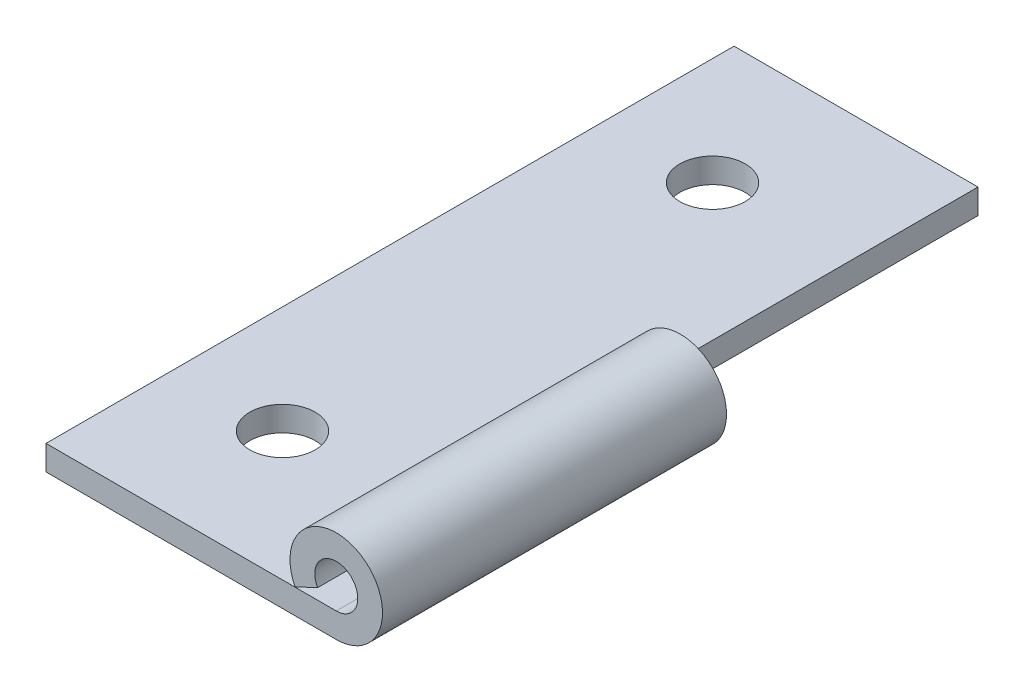
ISO-10303-21;
HEADER;
FILE_DESCRIPTION(('STEP AP214'),'2;1');
FILE_NAME('part.step','',(''),(''),'','','');
FILE_SCHEMA(('AUTOMOTIVE_DESIGN { 1 0 10303 214 1 1 1 1 }'));
ENDSEC;
DATA;
#1=APPLICATION_CONTEXT('core data for automotive mechanical design processes');
#2=APPLICATION_PROTOCOL_DEFINITION('international standard','automotive_design',2000,#1);
#3=PRODUCT_CONTEXT('',#1,'mechanical');
#4=PRODUCT('Part','Part','',(#3));
#5=PRODUCT_RELATED_PRODUCT_CATEGORY('part','',(#4));
#6=PRODUCT_DEFINITION_FORMATION('','',#4);
#7=PRODUCT_DEFINITION_CONTEXT('part definition',#1,'design');
#8=PRODUCT_DEFINITION('design','',#6,#7);
#9=PRODUCT_DEFINITION_SHAPE('','',#8);
#10=(LENGTH_UNIT() NAMED_UNIT(*) SI_UNIT(.MILLI.,.METRE.));
#11=(NAMED_UNIT(*) PLANE_ANGLE_UNIT() SI_UNIT($,.RADIAN.));
#12=(NAMED_UNIT(*) SI_UNIT($,.STERADIAN.) SOLID_ANGLE_UNIT());
#13=UNCERTAINTY_MEASURE_WITH_UNIT(LENGTH_MEASURE(1.E-05),#10,'distance_accuracy_value','');
#14=(GEOMETRIC_REPRESENTATION_CONTEXT(3) GLOBAL_UNCERTAINTY_ASSIGNED_CONTEXT((#13)) GLOBAL_UNIT_ASSIGNED_CONTEXT((#10,
#11,#12)) REPRESENTATION_CONTEXT('',''));
#15=CARTESIAN_POINT('',(0.,0.,0.));
#16=DIRECTION('',(0.,0.,1.));
#17=DIRECTION('',(1.,0.,0.));
#18=AXIS2_PLACEMENT_3D('',#15,#16,#17);
#19=CARTESIAN_POINT('',(-21.43125,0.,50.8));
#20=DIRECTION('',(0.,1.,0.));
#21=DIRECTION('',(0.,0.,1.));
#22=AXIS2_PLACEMENT_3D('',#19,#20,#21);
#23=PLANE('',#22);
#24=CARTESIAN_POINT('',(-13.49375,0.,9.525));
#25=DIRECTION('',(0.,1.,0.));
#26=DIRECTION('',(0.,0.,1.));
#27=AXIS2_PLACEMENT_3D('',#24,#25,#26);
#28=CIRCLE('',#27,2.413);
#29=CARTESIAN_POINT('',(-13.49375,0.,11.938));
#30=VERTEX_POINT('',#29);
#31=EDGE_CURVE('E241',#30,#30,#28,.T.);
#32=ORIENTED_EDGE('',*,*,#31,.T.);
#33=EDGE_LOOP('',(#32));
#34=FACE_BOUND('',#33,.T.);
#35=CARTESIAN_POINT('',(-13.49375,0.,41.275));
#36=DIRECTION('',(0.,1.,0.));
#37=DIRECTION('',(0.,0.,1.));
#38=AXIS2_PLACEMENT_3D('',#35,#36,#37);
#39=CIRCLE('',#38,2.413);
#40=CARTESIAN_POINT('',(-13.49375,0.,43.688));
#41=VERTEX_POINT('',#40);
#42=EDGE_CURVE('E197',#41,#41,#39,.T.);
#43=ORIENTED_EDGE('',*,*,#42,.T.);
#44=EDGE_LOOP('',(#43));
#45=FACE_BOUND('',#44,.T.);
#46=DIRECTION('',(0.,0.,1.));
#47=VECTOR('',#46,1.);
#48=CARTESIAN_POINT('',(-3.4163,0.,25.4));
#49=LINE('',#48,#47);
#50=CARTESIAN_POINT('',(-3.4163,0.,0.));
#51=VERTEX_POINT('',#50);
#52=CARTESIAN_POINT('',(-3.4163,0.,25.4));
#53=VERTEX_POINT('',#52);
#54=EDGE_CURVE('E70',#51,#53,#49,.T.);
#55=ORIENTED_EDGE('',*,*,#54,.T.);
#56=DIRECTION('',(1.,0.,0.));
#57=VECTOR('',#56,1.);
#58=CARTESIAN_POINT('',(-3.4163,0.,25.4));
#59=LINE('',#58,#57);
#60=CARTESIAN_POINT('',(0.,0.,25.4));
#61=VERTEX_POINT('',#60);
#62=EDGE_CURVE('E188',#53,#61,#59,.T.);
#63=ORIENTED_EDGE('',*,*,#62,.T.);
#64=DIRECTION('',(0.,0.,-1.));
#65=VECTOR('',#64,1.);
#66=CARTESIAN_POINT('',(0.,0.,50.8));
#67=LINE('',#66,#65);
#68=CARTESIAN_POINT('',(0.,0.,50.8));
#69=VERTEX_POINT('',#68);
#70=EDGE_CURVE('E155',#69,#61,#67,.T.);
#71=ORIENTED_EDGE('',*,*,#70,.F.);
#72=DIRECTION('',(1.,0.,0.));
#73=VECTOR('',#72,1.);
#74=CARTESIAN_POINT('',(-21.43125,0.,50.8));
#75=LINE('',#74,#73);
#76=CARTESIAN_POINT('',(-21.43125,0.,50.8));
#77=VERTEX_POINT('',#76);
#78=EDGE_CURVE('E103',#77,#69,#75,.T.);
#79=ORIENTED_EDGE('',*,*,#78,.F.);
#80=DIRECTION('',(0.,0.,-1.));
#81=VECTOR('',#80,1.);
#82=CARTESIAN_POINT('',(-21.43125,0.,50.8));
#83=LINE('',#82,#81);
#84=CARTESIAN_POINT('',(-21.43125,0.,0.));
#85=VERTEX_POINT('',#84);
#86=EDGE_CURVE('E158',#77,#85,#83,.T.);
#87=ORIENTED_EDGE('',*,*,#86,.T.);
#88=DIRECTION('',(1.,0.,0.));
#89=VECTOR('',#88,1.);
#90=CARTESIAN_POINT('',(-21.43125,0.,0.));
#91=LINE('',#90,#89);
#92=EDGE_CURVE('E146',#85,#51,#91,.T.);
#93=ORIENTED_EDGE('',*,*,#92,.T.);
#94=EDGE_LOOP('',(#55,#63,#71,#79,#87,#93));
#95=FACE_BOUND('',#94,.T.);
#96=ADVANCED_FACE('F55',(#34,#45,#95),#23,.F.);
#97=CARTESIAN_POINT('',(0.,3.4163,50.8));
#98=DIRECTION('',(0.,0.,-1.));
#99=DIRECTION('',(-1.,0.,0.));
#100=AXIS2_PLACEMENT_3D('',#97,#98,#99);
#101=CYLINDRICAL_SURFACE('',#100,3.4163);
#102=CARTESIAN_POINT('',(0.,3.4163,25.4));
#103=DIRECTION('',(0.,0.,-1.));
#104=DIRECTION('',(-1.,0.,0.));
#105=AXIS2_PLACEMENT_3D('',#102,#103,#104);
#106=CIRCLE('',#105,3.4163);
#107=CARTESIAN_POINT('',(-3.03824773183492,1.8542,25.4));
#108=VERTEX_POINT('',#107);
#109=EDGE_CURVE('E147',#108,#61,#106,.T.);
#110=ORIENTED_EDGE('',*,*,#109,.F.);
#111=DIRECTION('',(0.,0.,-1.));
#112=VECTOR('',#111,1.);
#113=CARTESIAN_POINT('',(-3.03824773183492,1.8542,50.8));
#114=LINE('',#113,#112);
#115=CARTESIAN_POINT('',(-3.03824773183492,1.8542,50.8));
#116=VERTEX_POINT('',#115);
#117=EDGE_CURVE('E133',#116,#108,#114,.T.);
#118=ORIENTED_EDGE('',*,*,#117,.F.);
#119=CARTESIAN_POINT('',(0.,3.4163,50.8));
#120=DIRECTION('',(0.,0.,1.));
#121=DIRECTION('',(1.,0.,0.));
#122=AXIS2_PLACEMENT_3D('',#119,#120,#121);
#123=CIRCLE('',#122,3.4163);
#124=EDGE_CURVE('E119',#69,#116,#123,.T.);
#125=ORIENTED_EDGE('',*,*,#124,.F.);
#126=ORIENTED_EDGE('',*,*,#70,.T.);
#127=EDGE_LOOP('',(#110,#118,#125,#126));
#128=FACE_BOUND('',#127,.T.);
#129=ADVANCED_FACE('F206',(#128),#101,.T.);
#130=CARTESIAN_POINT('',(-3.03824773183491,1.8542,50.8));
#131=DIRECTION('',(-0.4226182617407,0.906307787036649,0.));
#132=DIRECTION('',(-0.906307787036649,-0.4226182617407,0.));
#133=AXIS2_PLACEMENT_3D('',#130,#131,#132);
#134=PLANE('',#133);
#135=DIRECTION('',(-0.906307787036649,-0.4226182617407,0.));
#136=VECTOR('',#135,1.);
#137=CARTESIAN_POINT('',(-3.03824773183491,1.8542,25.4));
#138=LINE('',#137,#136);
#139=CARTESIAN_POINT('',(-1.37813295508886,2.62832423381296,25.4));
#140=VERTEX_POINT('',#139);
#141=EDGE_CURVE('E130',#140,#108,#138,.T.);
#142=ORIENTED_EDGE('',*,*,#141,.F.);
#143=DIRECTION('',(0.,0.,-1.));
#144=VECTOR('',#143,1.);
#145=CARTESIAN_POINT('',(-1.37813295508886,2.62832423381296,50.8));
#146=LINE('',#145,#144);
#147=CARTESIAN_POINT('',(-1.37813295508886,2.62832423381296,50.8));
#148=VERTEX_POINT('',#147);
#149=EDGE_CURVE('E126',#148,#140,#146,.T.);
#150=ORIENTED_EDGE('',*,*,#149,.F.);
#151=DIRECTION('',(0.90630778703665,0.422618261740701,0.));
#152=VECTOR('',#151,1.);
#153=CARTESIAN_POINT('',(-3.03824773183491,1.8542,50.8));
#154=LINE('',#153,#152);
#155=EDGE_CURVE('E112',#116,#148,#154,.T.);
#156=ORIENTED_EDGE('',*,*,#155,.F.);
#157=ORIENTED_EDGE('',*,*,#117,.T.);
#158=EDGE_LOOP('',(#142,#150,#156,#157));
#159=FACE_BOUND('',#158,.T.);
#160=ADVANCED_FACE('F127',(#159),#134,.F.);
#161=CARTESIAN_POINT('',(0.,3.4163,50.8));
#162=DIRECTION('',(0.,0.,-1.));
#163=DIRECTION('',(-1.,0.,0.));
#164=AXIS2_PLACEMENT_3D('',#161,#162,#163);
#165=CYLINDRICAL_SURFACE('',#164,1.5875);
#166=CARTESIAN_POINT('',(0.,3.4163,25.4));
#167=DIRECTION('',(0.,0.,-1.));
#168=DIRECTION('',(-1.,0.,0.));
#169=AXIS2_PLACEMENT_3D('',#166,#167,#168);
#170=CIRCLE('',#169,1.5875);
#171=CARTESIAN_POINT('',(0.,1.8288,25.4));
#172=VERTEX_POINT('',#171);
#173=EDGE_CURVE('E170',#172,#140,#170,.F.);
#174=ORIENTED_EDGE('',*,*,#173,.F.);
#175=DIRECTION('',(0.,0.,-1.));
#176=VECTOR('',#175,1.);
#177=CARTESIAN_POINT('',(0.,1.8288,50.8));
#178=LINE('',#177,#176);
#179=CARTESIAN_POINT('',(0.,1.8288,50.8));
#180=VERTEX_POINT('',#179);
#181=EDGE_CURVE('E134',#180,#172,#178,.T.);
#182=ORIENTED_EDGE('',*,*,#181,.F.);
#183=CARTESIAN_POINT('',(0.,3.4163,50.8));
#184=DIRECTION('',(0.,0.,-1.));
#185=DIRECTION('',(1.,0.,0.));
#186=AXIS2_PLACEMENT_3D('',#183,#184,#185);
#187=CIRCLE('',#186,1.5875);
#188=EDGE_CURVE('E116',#148,#180,#187,.T.);
#189=ORIENTED_EDGE('',*,*,#188,.F.);
#190=ORIENTED_EDGE('',*,*,#149,.T.);
#191=EDGE_LOOP('',(#174,#182,#189,#190));
#192=FACE_BOUND('',#191,.T.);
#193=ADVANCED_FACE('F136',(#192),#165,.F.);
#194=CARTESIAN_POINT('',(-21.43125,1.8288,50.8));
#195=DIRECTION('',(0.,-1.,0.));
#196=DIRECTION('',(0.,0.,-1.));
#197=AXIS2_PLACEMENT_3D('',#194,#195,#196);
#198=PLANE('',#197);
#199=CARTESIAN_POINT('',(-13.49375,1.8288,9.525));
#200=DIRECTION('',(0.,1.,0.));
#201=DIRECTION('',(0.,0.,1.));
#202=AXIS2_PLACEMENT_3D('',#199,#200,#201);
#203=CIRCLE('',#202,2.413);
#204=CARTESIAN_POINT('',(-13.49375,1.8288,11.938));
#205=VERTEX_POINT('',#204);
#206=EDGE_CURVE('E244',#205,#205,#203,.T.);
#207=ORIENTED_EDGE('',*,*,#206,.F.);
#208=EDGE_LOOP('',(#207));
#209=FACE_BOUND('',#208,.T.);
#210=CARTESIAN_POINT('',(-13.49375,1.8288,41.275));
#211=DIRECTION('',(0.,1.,0.));
#212=DIRECTION('',(0.,0.,1.));
#213=AXIS2_PLACEMENT_3D('',#210,#211,#212);
#214=CIRCLE('',#213,2.413);
#215=CARTESIAN_POINT('',(-13.49375,1.8288,43.688));
#216=VERTEX_POINT('',#215);
#217=EDGE_CURVE('E194',#216,#216,#214,.T.);
#218=ORIENTED_EDGE('',*,*,#217,.F.);
#219=EDGE_LOOP('',(#218));
#220=FACE_BOUND('',#219,.T.);
#221=DIRECTION('',(0.,0.,1.));
#222=VECTOR('',#221,1.);
#223=CARTESIAN_POINT('',(-3.4163,1.8288,50.8));
#224=LINE('',#223,#222);
#225=CARTESIAN_POINT('',(-3.4163,1.8288,0.));
#226=VERTEX_POINT('',#225);
#227=CARTESIAN_POINT('',(-3.4163,1.8288,25.4));
#228=VERTEX_POINT('',#227);
#229=EDGE_CURVE('E163',#226,#228,#224,.T.);
#230=ORIENTED_EDGE('',*,*,#229,.F.);
#231=DIRECTION('',(-1.,0.,0.));
#232=VECTOR('',#231,1.);
#233=CARTESIAN_POINT('',(-21.43125,1.8288,0.));
#234=LINE('',#233,#232);
#235=CARTESIAN_POINT('',(-21.43125,1.8288,0.));
#236=VERTEX_POINT('',#235);
#237=EDGE_CURVE('E94',#226,#236,#234,.T.);
#238=ORIENTED_EDGE('',*,*,#237,.T.);
#239=DIRECTION('',(0.,0.,-1.));
#240=VECTOR('',#239,1.);
#241=CARTESIAN_POINT('',(-21.43125,1.8288,50.8));
#242=LINE('',#241,#240);
#243=CARTESIAN_POINT('',(-21.43125,1.8288,50.8));
#244=VERTEX_POINT('',#243);
#245=EDGE_CURVE('E139',#244,#236,#242,.T.);
#246=ORIENTED_EDGE('',*,*,#245,.F.);
#247=DIRECTION('',(-1.,0.,0.));
#248=VECTOR('',#247,1.);
#249=CARTESIAN_POINT('',(-21.43125,1.8288,50.8));
#250=LINE('',#249,#248);
#251=EDGE_CURVE('E79',#180,#244,#250,.T.);
#252=ORIENTED_EDGE('',*,*,#251,.F.);
#253=ORIENTED_EDGE('',*,*,#181,.T.);
#254=DIRECTION('',(1.,0.,0.));
#255=VECTOR('',#254,1.);
#256=CARTESIAN_POINT('',(-21.43125,1.8288,25.4));
#257=LINE('',#256,#255);
#258=EDGE_CURVE('E13',#228,#172,#257,.T.);
#259=ORIENTED_EDGE('',*,*,#258,.F.);
#260=EDGE_LOOP('',(#230,#238,#246,#252,#253,#259));
#261=FACE_BOUND('',#260,.T.);
#262=ADVANCED_FACE('F169',(#209,#220,#261),#198,.F.);
#263=CARTESIAN_POINT('',(0.,3.4163,0.));
#264=DIRECTION('',(0.,0.,1.));
#265=DIRECTION('',(1.,0.,0.));
#266=AXIS2_PLACEMENT_3D('',#263,#264,#265);
#267=PLANE('',#266);
#268=DIRECTION('',(0.,1.,0.));
#269=VECTOR('',#268,1.);
#270=CARTESIAN_POINT('',(-3.4163,3.4163,0.));
#271=LINE('',#270,#269);
#272=EDGE_CURVE('E63',#51,#226,#271,.T.);
#273=ORIENTED_EDGE('',*,*,#272,.F.);
#274=ORIENTED_EDGE('',*,*,#92,.F.);
#275=DIRECTION('',(0.,-1.,0.));
#276=VECTOR('',#275,1.);
#277=CARTESIAN_POINT('',(-21.43125,0.,0.));
#278=LINE('',#277,#276);
#279=EDGE_CURVE('E143',#236,#85,#278,.T.);
#280=ORIENTED_EDGE('',*,*,#279,.F.);
#281=ORIENTED_EDGE('',*,*,#237,.F.);
#282=EDGE_LOOP('',(#273,#274,#280,#281));
#283=FACE_BOUND('',#282,.T.);
#284=ADVANCED_FACE('F174',(#283),#267,.F.);
#285=CARTESIAN_POINT('',(-21.43125,0.,50.8));
#286=DIRECTION('',(1.,0.,0.));
#287=DIRECTION('',(0.,0.,-1.));
#288=AXIS2_PLACEMENT_3D('',#285,#286,#287);
#289=PLANE('',#288);
#290=ORIENTED_EDGE('',*,*,#279,.T.);
#291=ORIENTED_EDGE('',*,*,#86,.F.);
#292=DIRECTION('',(0.,-1.,0.));
#293=VECTOR('',#292,1.);
#294=CARTESIAN_POINT('',(-21.43125,0.,50.8));
#295=LINE('',#294,#293);
#296=EDGE_CURVE('E151',#244,#77,#295,.T.);
#297=ORIENTED_EDGE('',*,*,#296,.F.);
#298=ORIENTED_EDGE('',*,*,#245,.T.);
#299=EDGE_LOOP('',(#290,#291,#297,#298));
#300=FACE_BOUND('',#299,.T.);
#301=ADVANCED_FACE('F57',(#300),#289,.F.);
#302=CARTESIAN_POINT('',(0.,3.4163,50.8));
#303=DIRECTION('',(0.,0.,1.));
#304=DIRECTION('',(1.,0.,0.));
#305=AXIS2_PLACEMENT_3D('',#302,#303,#304);
#306=PLANE('',#305);
#307=ORIENTED_EDGE('',*,*,#296,.T.);
#308=ORIENTED_EDGE('',*,*,#78,.T.);
#309=ORIENTED_EDGE('',*,*,#124,.T.);
#310=ORIENTED_EDGE('',*,*,#155,.T.);
#311=ORIENTED_EDGE('',*,*,#188,.T.);
#312=ORIENTED_EDGE('',*,*,#251,.T.);
#313=EDGE_LOOP('',(#307,#308,#309,#310,#311,#312));
#314=FACE_BOUND('',#313,.T.);
#315=ADVANCED_FACE('F114',(#314),#306,.T.);
#316=CARTESIAN_POINT('',(-3.4163,6.8326,25.4));
#317=DIRECTION('',(0.,0.,-1.));
#318=DIRECTION('',(-1.,0.,0.));
#319=AXIS2_PLACEMENT_3D('',#316,#317,#318);
#320=PLANE('',#319);
#321=ORIENTED_EDGE('',*,*,#109,.T.);
#322=ORIENTED_EDGE('',*,*,#62,.F.);
#323=DIRECTION('',(0.,-1.,0.));
#324=VECTOR('',#323,1.);
#325=CARTESIAN_POINT('',(-3.4163,6.8326,25.4));
#326=LINE('',#325,#324);
#327=EDGE_CURVE('E171',#228,#53,#326,.T.);
#328=ORIENTED_EDGE('',*,*,#327,.F.);
#329=ORIENTED_EDGE('',*,*,#258,.T.);
#330=ORIENTED_EDGE('',*,*,#173,.T.);
#331=ORIENTED_EDGE('',*,*,#141,.T.);
#332=EDGE_LOOP('',(#321,#322,#328,#329,#330,#331));
#333=FACE_BOUND('',#332,.T.);
#334=ADVANCED_FACE('F191',(#333),#320,.T.);
#335=CARTESIAN_POINT('',(-3.4163,6.8326,25.4));
#336=DIRECTION('',(1.,0.,0.));
#337=DIRECTION('',(0.,0.,-1.));
#338=AXIS2_PLACEMENT_3D('',#335,#336,#337);
#339=PLANE('',#338);
#340=ORIENTED_EDGE('',*,*,#229,.T.);
#341=ORIENTED_EDGE('',*,*,#327,.T.);
#342=ORIENTED_EDGE('',*,*,#54,.F.);
#343=ORIENTED_EDGE('',*,*,#272,.T.);
#344=EDGE_LOOP('',(#340,#341,#342,#343));
#345=FACE_BOUND('',#344,.T.);
#346=ADVANCED_FACE('F161',(#345),#339,.T.);
#347=CARTESIAN_POINT('',(-13.49375,1.8288,41.275));
#348=DIRECTION('',(0.,1.,0.));
#349=DIRECTION('',(0.,0.,1.));
#350=AXIS2_PLACEMENT_3D('',#347,#348,#349);
#351=CYLINDRICAL_SURFACE('',#350,2.413);
#352=ORIENTED_EDGE('',*,*,#42,.F.);
#353=EDGE_LOOP('',(#352));
#354=FACE_BOUND('',#353,.T.);
#355=ORIENTED_EDGE('',*,*,#217,.T.);
#356=EDGE_LOOP('',(#355));
#357=FACE_BOUND('',#356,.T.);
#358=ADVANCED_FACE('F227',(#354,#357),#351,.F.);
#359=CARTESIAN_POINT('',(-13.49375,1.8288,9.525));
#360=DIRECTION('',(0.,1.,0.));
#361=DIRECTION('',(0.,0.,1.));
#362=AXIS2_PLACEMENT_3D('',#359,#360,#361);
#363=CYLINDRICAL_SURFACE('',#362,2.413);
#364=ORIENTED_EDGE('',*,*,#31,.F.);
#365=EDGE_LOOP('',(#364));
#366=FACE_BOUND('',#365,.T.);
#367=ORIENTED_EDGE('',*,*,#206,.T.);
#368=EDGE_LOOP('',(#367));
#369=FACE_BOUND('',#368,.T.);
#370=ADVANCED_FACE('F232',(#366,#369),#363,.F.);
#371=CLOSED_SHELL('',(#96,#129,#160,#193,#262,#284,#301,#315,#334,#346,#358,#370));
#372=MANIFOLD_SOLID_BREP('B2',#371);
#373=ADVANCED_BREP_SHAPE_REPRESENTATION('',(#18,#372),#14);
#374=SHAPE_DEFINITION_REPRESENTATION(#9,#373);
ENDSEC;
END-ISO-10303-21;
